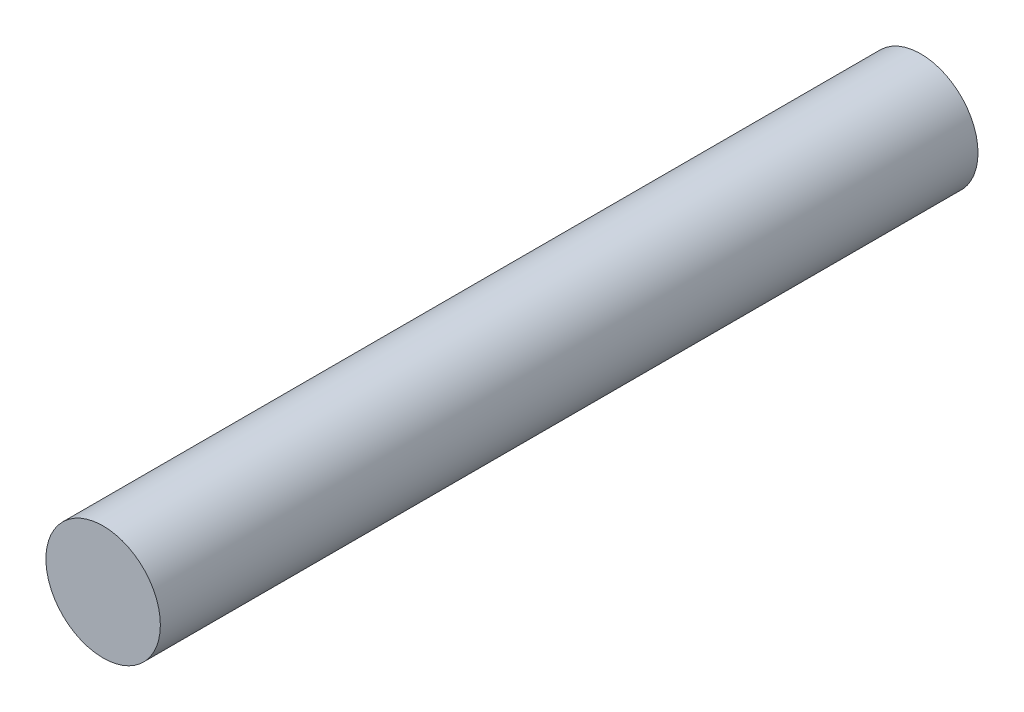
ISO-10303-21;
HEADER;
FILE_DESCRIPTION(('STEP AP214'),'2;1');
FILE_NAME('part.step','',(''),(''),'','','');
FILE_SCHEMA(('AUTOMOTIVE_DESIGN { 1 0 10303 214 1 1 1 1 }'));
ENDSEC;
DATA;
#1=APPLICATION_CONTEXT('core data for automotive mechanical design processes');
#2=APPLICATION_PROTOCOL_DEFINITION('international standard','automotive_design',2000,#1);
#3=PRODUCT_CONTEXT('',#1,'mechanical');
#4=PRODUCT('Part','Part','',(#3));
#5=PRODUCT_RELATED_PRODUCT_CATEGORY('part','',(#4));
#6=PRODUCT_DEFINITION_FORMATION('','',#4);
#7=PRODUCT_DEFINITION_CONTEXT('part definition',#1,'design');
#8=PRODUCT_DEFINITION('design','',#6,#7);
#9=PRODUCT_DEFINITION_SHAPE('','',#8);
#10=(LENGTH_UNIT() NAMED_UNIT(*) SI_UNIT(.MILLI.,.METRE.));
#11=(NAMED_UNIT(*) PLANE_ANGLE_UNIT() SI_UNIT($,.RADIAN.));
#12=(NAMED_UNIT(*) SI_UNIT($,.STERADIAN.) SOLID_ANGLE_UNIT());
#13=UNCERTAINTY_MEASURE_WITH_UNIT(LENGTH_MEASURE(1.E-05),#10,'distance_accuracy_value','');
#14=(GEOMETRIC_REPRESENTATION_CONTEXT(3) GLOBAL_UNCERTAINTY_ASSIGNED_CONTEXT((#13)) GLOBAL_UNIT_ASSIGNED_CONTEXT((#10,
#11,#12)) REPRESENTATION_CONTEXT('',''));
#15=CARTESIAN_POINT('',(0.,0.,0.));
#16=DIRECTION('',(0.,0.,1.));
#17=DIRECTION('',(1.,0.,0.));
#18=AXIS2_PLACEMENT_3D('',#15,#16,#17);
#19=CARTESIAN_POINT('',(0.,0.,40.));
#20=DIRECTION('',(0.,0.,-1.));
#21=DIRECTION('',(-1.,0.,0.));
#22=AXIS2_PLACEMENT_3D('',#19,#20,#21);
#23=CYLINDRICAL_SURFACE('',#22,2.8);
#24=CARTESIAN_POINT('',(0.,0.,40.));
#25=DIRECTION('',(0.,0.,1.));
#26=DIRECTION('',(1.,0.,0.));
#27=AXIS2_PLACEMENT_3D('',#24,#25,#26);
#28=CIRCLE('',#27,2.8);
#29=CARTESIAN_POINT('',(2.8,0.,40.));
#30=VERTEX_POINT('',#29);
#31=EDGE_CURVE('E10',#30,#30,#28,.T.);
#32=ORIENTED_EDGE('',*,*,#31,.F.);
#33=EDGE_LOOP('',(#32));
#34=FACE_BOUND('',#33,.T.);
#35=CARTESIAN_POINT('',(0.,0.,0.));
#36=DIRECTION('',(0.,0.,1.));
#37=DIRECTION('',(1.,0.,0.));
#38=AXIS2_PLACEMENT_3D('',#35,#36,#37);
#39=CIRCLE('',#38,2.8);
#40=CARTESIAN_POINT('',(2.8,0.,0.));
#41=VERTEX_POINT('',#40);
#42=EDGE_CURVE('E46',#41,#41,#39,.T.);
#43=ORIENTED_EDGE('',*,*,#42,.T.);
#44=EDGE_LOOP('',(#43));
#45=FACE_BOUND('',#44,.T.);
#46=ADVANCED_FACE('F43',(#34,#45),#23,.T.);
#47=CARTESIAN_POINT('',(0.,0.,40.));
#48=DIRECTION('',(0.,0.,1.));
#49=DIRECTION('',(1.,0.,0.));
#50=AXIS2_PLACEMENT_3D('',#47,#48,#49);
#51=PLANE('',#50);
#52=ORIENTED_EDGE('',*,*,#31,.T.);
#53=EDGE_LOOP('',(#52));
#54=FACE_BOUND('',#53,.T.);
#55=ADVANCED_FACE('F60',(#54),#51,.T.);
#56=CARTESIAN_POINT('',(0.,0.,0.));
#57=DIRECTION('',(0.,0.,1.));
#58=DIRECTION('',(1.,0.,0.));
#59=AXIS2_PLACEMENT_3D('',#56,#57,#58);
#60=PLANE('',#59);
#61=ORIENTED_EDGE('',*,*,#42,.F.);
#62=EDGE_LOOP('',(#61));
#63=FACE_BOUND('',#62,.T.);
#64=ADVANCED_FACE('F58',(#63),#60,.F.);
#65=CLOSED_SHELL('',(#46,#55,#64));
#66=MANIFOLD_SOLID_BREP('B2',#65);
#67=ADVANCED_BREP_SHAPE_REPRESENTATION('',(#18,#66),#14);
#68=SHAPE_DEFINITION_REPRESENTATION(#9,#67);
ENDSEC;
END-ISO-10303-21;
